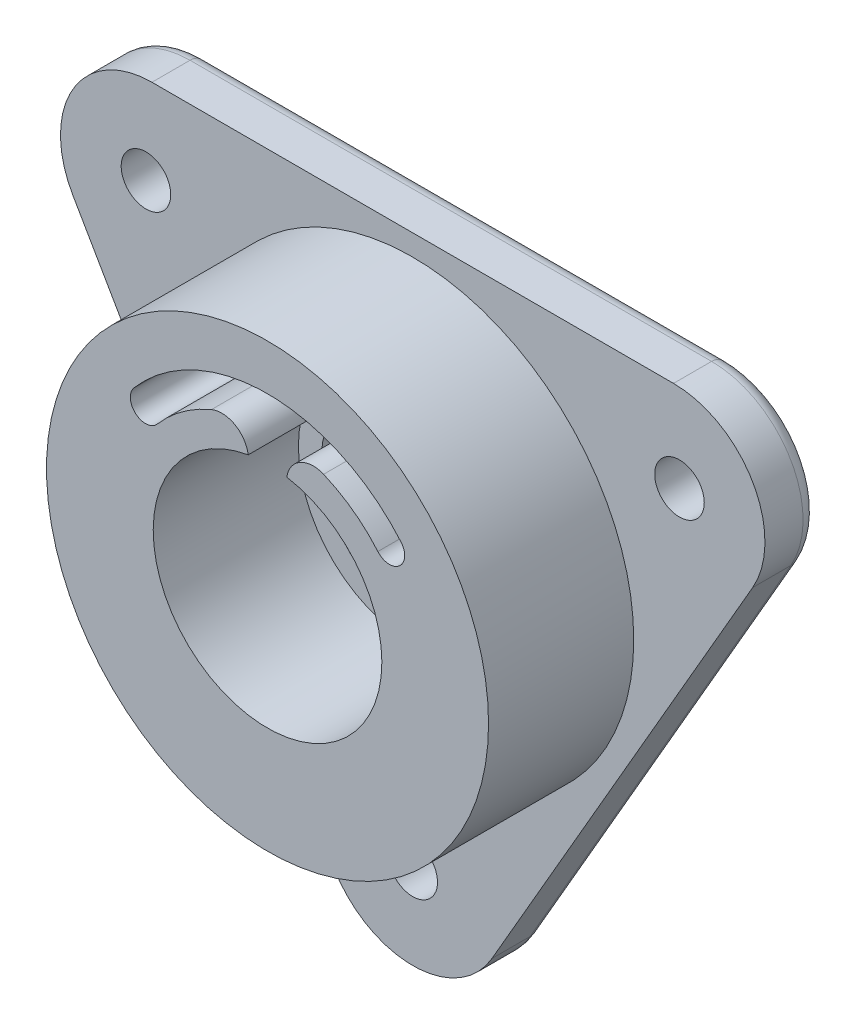
ISO-10303-21;
HEADER;
FILE_DESCRIPTION(('STEP AP214'),'2;1');
FILE_NAME('part.step','',(''),(''),'','','');
FILE_SCHEMA(('AUTOMOTIVE_DESIGN { 1 0 10303 214 1 1 1 1 }'));
ENDSEC;
DATA;
#1=APPLICATION_CONTEXT('core data for automotive mechanical design processes');
#2=APPLICATION_PROTOCOL_DEFINITION('international standard','automotive_design',2000,#1);
#3=PRODUCT_CONTEXT('',#1,'mechanical');
#4=PRODUCT('Part','Part','',(#3));
#5=PRODUCT_RELATED_PRODUCT_CATEGORY('part','',(#4));
#6=PRODUCT_DEFINITION_FORMATION('','',#4);
#7=PRODUCT_DEFINITION_CONTEXT('part definition',#1,'design');
#8=PRODUCT_DEFINITION('design','',#6,#7);
#9=PRODUCT_DEFINITION_SHAPE('','',#8);
#10=(LENGTH_UNIT() NAMED_UNIT(*) SI_UNIT(.MILLI.,.METRE.));
#11=(NAMED_UNIT(*) PLANE_ANGLE_UNIT() SI_UNIT($,.RADIAN.));
#12=(NAMED_UNIT(*) SI_UNIT($,.STERADIAN.) SOLID_ANGLE_UNIT());
#13=UNCERTAINTY_MEASURE_WITH_UNIT(LENGTH_MEASURE(1.E-05),#10,'distance_accuracy_value','');
#14=(GEOMETRIC_REPRESENTATION_CONTEXT(3) GLOBAL_UNCERTAINTY_ASSIGNED_CONTEXT((#13)) GLOBAL_UNIT_ASSIGNED_CONTEXT((#10,
#11,#12)) REPRESENTATION_CONTEXT('',''));
#15=CARTESIAN_POINT('',(0.,0.,0.));
#16=DIRECTION('',(0.,0.,1.));
#17=DIRECTION('',(1.,0.,0.));
#18=AXIS2_PLACEMENT_3D('',#15,#16,#17);
#19=CARTESIAN_POINT('',(0.,0.,0.));
#20=DIRECTION('',(0.,0.,-1.));
#21=DIRECTION('',(-1.,0.,0.));
#22=AXIS2_PLACEMENT_3D('',#19,#20,#21);
#23=PLANE('',#22);
#24=CARTESIAN_POINT('',(0.,-20.2072594216369,0.));
#25=DIRECTION('',(0.,0.,1.));
#26=DIRECTION('',(1.,0.,0.));
#27=AXIS2_PLACEMENT_3D('',#24,#25,#26);
#28=CIRCLE('',#27,1.625);
#29=CARTESIAN_POINT('',(1.62500000000001,-20.2072594216369,0.));
#30=VERTEX_POINT('',#29);
#31=EDGE_CURVE('E204',#30,#30,#28,.T.);
#32=ORIENTED_EDGE('',*,*,#31,.T.);
#33=EDGE_LOOP('',(#32));
#34=FACE_BOUND('',#33,.T.);
#35=CARTESIAN_POINT('',(17.5,10.1036297108185,0.));
#36=DIRECTION('',(0.,0.,1.));
#37=DIRECTION('',(1.,0.,0.));
#38=AXIS2_PLACEMENT_3D('',#35,#36,#37);
#39=CIRCLE('',#38,1.625);
#40=CARTESIAN_POINT('',(19.125,10.1036297108185,0.));
#41=VERTEX_POINT('',#40);
#42=EDGE_CURVE('E210',#41,#41,#39,.T.);
#43=ORIENTED_EDGE('',*,*,#42,.T.);
#44=EDGE_LOOP('',(#43));
#45=FACE_BOUND('',#44,.T.);
#46=CARTESIAN_POINT('',(-17.5,10.1036297108185,0.));
#47=DIRECTION('',(0.,0.,1.));
#48=DIRECTION('',(1.,0.,0.));
#49=AXIS2_PLACEMENT_3D('',#46,#47,#48);
#50=CIRCLE('',#49,1.625);
#51=CARTESIAN_POINT('',(-15.875,10.1036297108185,0.));
#52=VERTEX_POINT('',#51);
#53=EDGE_CURVE('E194',#52,#52,#50,.T.);
#54=ORIENTED_EDGE('',*,*,#53,.T.);
#55=EDGE_LOOP('',(#54));
#56=FACE_BOUND('',#55,.T.);
#57=CARTESIAN_POINT('',(0.,-19.7542648054294,0.));
#58=DIRECTION('',(0.,0.,-1.));
#59=DIRECTION('',(-1.,0.,0.));
#60=AXIS2_PLACEMENT_3D('',#57,#58,#59);
#61=CIRCLE('',#60,5.);
#62=CARTESIAN_POINT('',(-4.33012701892219,-22.2542648054294,0.));
#63=VERTEX_POINT('',#62);
#64=CARTESIAN_POINT('',(4.33012701892219,-22.2542648054294,0.));
#65=VERTEX_POINT('',#64);
#66=EDGE_CURVE('E256',#63,#65,#61,.F.);
#67=ORIENTED_EDGE('',*,*,#66,.F.);
#68=DIRECTION('',(0.5,-0.866025403784439,0.));
#69=VECTOR('',#68,1.);
#70=CARTESIAN_POINT('',(-26.6339745962156,16.3771324027147,0.));
#71=LINE('',#70,#69);
#72=CARTESIAN_POINT('',(-21.4378221735089,7.37713240271472,0.));
#73=VERTEX_POINT('',#72);
#74=EDGE_CURVE('E231',#63,#73,#71,.F.);
#75=ORIENTED_EDGE('',*,*,#74,.T.);
#76=CARTESIAN_POINT('',(-17.1076951545867,9.87713240271472,0.));
#77=DIRECTION('',(0.,0.,-1.));
#78=DIRECTION('',(-1.,0.,0.));
#79=AXIS2_PLACEMENT_3D('',#76,#77,#78);
#80=CIRCLE('',#79,5.);
#81=CARTESIAN_POINT('',(-17.1076951545867,14.8771324027147,0.));
#82=VERTEX_POINT('',#81);
#83=EDGE_CURVE('E254',#82,#73,#80,.F.);
#84=ORIENTED_EDGE('',*,*,#83,.F.);
#85=DIRECTION('',(-1.,0.,0.));
#86=VECTOR('',#85,1.);
#87=CARTESIAN_POINT('',(27.5,14.8771324027147,0.));
#88=LINE('',#87,#86);
#89=CARTESIAN_POINT('',(17.1076951545867,14.8771324027147,0.));
#90=VERTEX_POINT('',#89);
#91=EDGE_CURVE('E237',#82,#90,#88,.F.);
#92=ORIENTED_EDGE('',*,*,#91,.T.);
#93=CARTESIAN_POINT('',(17.1076951545867,9.87713240271472,0.));
#94=DIRECTION('',(0.,0.,-1.));
#95=DIRECTION('',(-1.,0.,0.));
#96=AXIS2_PLACEMENT_3D('',#93,#94,#95);
#97=CIRCLE('',#96,5.);
#98=CARTESIAN_POINT('',(21.4378221735089,7.37713240271472,0.));
#99=VERTEX_POINT('',#98);
#100=EDGE_CURVE('E251',#99,#90,#97,.F.);
#101=ORIENTED_EDGE('',*,*,#100,.F.);
#102=DIRECTION('',(0.5,0.866025403784439,0.));
#103=VECTOR('',#102,1.);
#104=CARTESIAN_POINT('',(-0.86602540378445,-31.2542648054294,0.));
#105=LINE('',#104,#103);
#106=EDGE_CURVE('E234',#99,#65,#105,.F.);
#107=ORIENTED_EDGE('',*,*,#106,.T.);
#108=EDGE_LOOP('',(#67,#75,#84,#92,#101,#107));
#109=FACE_BOUND('',#108,.T.);
#110=CARTESIAN_POINT('',(3.,7.14580296397823,0.));
#111=DIRECTION('',(0.,0.,-1.));
#112=DIRECTION('',(1.,0.,0.));
#113=AXIS2_PLACEMENT_3D('',#110,#111,#112);
#114=CIRCLE('',#113,1.75);
#115=CARTESIAN_POINT('',(2.32258064516129,5.53223455275734,0.));
#116=VERTEX_POINT('',#115);
#117=CARTESIAN_POINT('',(3.67741935483871,8.75937137519911,0.));
#118=VERTEX_POINT('',#117);
#119=EDGE_CURVE('E187',#116,#118,#114,.T.);
#120=ORIENTED_EDGE('',*,*,#119,.T.);
#121=CARTESIAN_POINT('',(0.,0.,0.));
#122=DIRECTION('',(0.,0.,-1.));
#123=DIRECTION('',(-1.,0.,0.));
#124=AXIS2_PLACEMENT_3D('',#121,#122,#123);
#125=CIRCLE('',#124,9.5);
#126=CARTESIAN_POINT('',(7.23809523809524,6.15304618252318,0.));
#127=VERTEX_POINT('',#126);
#128=EDGE_CURVE('E615',#118,#127,#125,.T.);
#129=ORIENTED_EDGE('',*,*,#128,.T.);
#130=CARTESIAN_POINT('',(8.,6.80073525436772,0.));
#131=DIRECTION('',(0.,0.,1.));
#132=DIRECTION('',(1.,0.,0.));
#133=AXIS2_PLACEMENT_3D('',#130,#131,#132);
#134=CIRCLE('',#133,1.);
#135=CARTESIAN_POINT('',(8.76190476190476,7.44842432621227,0.));
#136=VERTEX_POINT('',#135);
#137=EDGE_CURVE('E622',#127,#136,#134,.T.);
#138=ORIENTED_EDGE('',*,*,#137,.T.);
#139=CARTESIAN_POINT('',(0.,0.,0.));
#140=DIRECTION('',(0.,0.,1.));
#141=DIRECTION('',(1.,0.,0.));
#142=AXIS2_PLACEMENT_3D('',#139,#140,#141);
#143=CIRCLE('',#142,11.5);
#144=CARTESIAN_POINT('',(-8.76190476190476,7.44842432621227,0.));
#145=VERTEX_POINT('',#144);
#146=EDGE_CURVE('E312',#136,#145,#143,.T.);
#147=ORIENTED_EDGE('',*,*,#146,.T.);
#148=CARTESIAN_POINT('',(-8.,6.80073525436772,0.));
#149=DIRECTION('',(0.,0.,1.));
#150=DIRECTION('',(1.,0.,0.));
#151=AXIS2_PLACEMENT_3D('',#148,#149,#150);
#152=CIRCLE('',#151,1.);
#153=CARTESIAN_POINT('',(-7.23809523809524,6.15304618252318,0.));
#154=VERTEX_POINT('',#153);
#155=EDGE_CURVE('E620',#145,#154,#152,.T.);
#156=ORIENTED_EDGE('',*,*,#155,.T.);
#157=CARTESIAN_POINT('',(-3.67741935483871,8.75937137519911,0.));
#158=VERTEX_POINT('',#157);
#159=EDGE_CURVE('E186',#154,#158,#125,.T.);
#160=ORIENTED_EDGE('',*,*,#159,.T.);
#161=CARTESIAN_POINT('',(-3.,7.14580296397823,0.));
#162=DIRECTION('',(0.,0.,-1.));
#163=DIRECTION('',(1.,0.,0.));
#164=AXIS2_PLACEMENT_3D('',#161,#162,#163);
#165=CIRCLE('',#164,1.75);
#166=CARTESIAN_POINT('',(-2.32258064516129,5.53223455275734,0.));
#167=VERTEX_POINT('',#166);
#168=EDGE_CURVE('E55',#158,#167,#165,.T.);
#169=ORIENTED_EDGE('',*,*,#168,.T.);
#170=CARTESIAN_POINT('',(0.,0.,0.));
#171=DIRECTION('',(0.,0.,1.));
#172=DIRECTION('',(1.,0.,0.));
#173=AXIS2_PLACEMENT_3D('',#170,#171,#172);
#174=CIRCLE('',#173,6.);
#175=EDGE_CURVE('E183',#167,#116,#174,.T.);
#176=ORIENTED_EDGE('',*,*,#175,.T.);
#177=EDGE_LOOP('',(#120,#129,#138,#147,#156,#160,#169,#176));
#178=FACE_BOUND('',#177,.T.);
#179=ADVANCED_FACE('F38',(#34,#45,#56,#109,#178),#23,.T.);
#180=CARTESIAN_POINT('',(0.,0.,13.025));
#181=DIRECTION('',(0.,0.,1.));
#182=DIRECTION('',(1.,0.,0.));
#183=AXIS2_PLACEMENT_3D('',#180,#181,#182);
#184=PLANE('',#183);
#185=CARTESIAN_POINT('',(0.,0.,13.025));
#186=DIRECTION('',(0.,0.,1.));
#187=DIRECTION('',(1.,0.,0.));
#188=AXIS2_PLACEMENT_3D('',#185,#186,#187);
#189=CIRCLE('',#188,14.5);
#190=CARTESIAN_POINT('',(14.5,0.,13.025));
#191=VERTEX_POINT('',#190);
#192=EDGE_CURVE('E192',#191,#191,#189,.T.);
#193=ORIENTED_EDGE('',*,*,#192,.T.);
#194=EDGE_LOOP('',(#193));
#195=FACE_BOUND('',#194,.T.);
#196=CARTESIAN_POINT('',(3.,7.14580296397823,13.025));
#197=DIRECTION('',(0.,0.,-1.));
#198=DIRECTION('',(1.,0.,0.));
#199=AXIS2_PLACEMENT_3D('',#196,#197,#198);
#200=CIRCLE('',#199,1.75);
#201=CARTESIAN_POINT('',(1.2674235171821,7.39213349636583,13.025));
#202=VERTEX_POINT('',#201);
#203=CARTESIAN_POINT('',(3.67741935483871,8.75937137519911,13.025));
#204=VERTEX_POINT('',#203);
#205=EDGE_CURVE('E63',#202,#204,#200,.T.);
#206=ORIENTED_EDGE('',*,*,#205,.F.);
#207=CARTESIAN_POINT('',(0.,0.,13.025));
#208=DIRECTION('',(0.,0.,1.));
#209=DIRECTION('',(1.,0.,0.));
#210=AXIS2_PLACEMENT_3D('',#207,#208,#209);
#211=CIRCLE('',#210,7.5);
#212=CARTESIAN_POINT('',(-1.2674235171821,7.39213349636583,13.025));
#213=VERTEX_POINT('',#212);
#214=EDGE_CURVE('E197',#213,#202,#211,.T.);
#215=ORIENTED_EDGE('',*,*,#214,.F.);
#216=CARTESIAN_POINT('',(-3.,7.14580296397823,13.025));
#217=DIRECTION('',(0.,0.,-1.));
#218=DIRECTION('',(1.,0.,0.));
#219=AXIS2_PLACEMENT_3D('',#216,#217,#218);
#220=CIRCLE('',#219,1.75);
#221=CARTESIAN_POINT('',(-3.67741935483871,8.75937137519911,13.025));
#222=VERTEX_POINT('',#221);
#223=EDGE_CURVE('E645',#222,#213,#220,.T.);
#224=ORIENTED_EDGE('',*,*,#223,.F.);
#225=CARTESIAN_POINT('',(0.,0.,13.025));
#226=DIRECTION('',(0.,0.,-1.));
#227=DIRECTION('',(-1.,0.,0.));
#228=AXIS2_PLACEMENT_3D('',#225,#226,#227);
#229=CIRCLE('',#228,9.5);
#230=CARTESIAN_POINT('',(-7.23809523809524,6.15304618252318,13.025));
#231=VERTEX_POINT('',#230);
#232=EDGE_CURVE('E633',#231,#222,#229,.T.);
#233=ORIENTED_EDGE('',*,*,#232,.F.);
#234=CARTESIAN_POINT('',(-8.,6.80073525436772,13.025));
#235=DIRECTION('',(0.,0.,1.));
#236=DIRECTION('',(1.,0.,0.));
#237=AXIS2_PLACEMENT_3D('',#234,#235,#236);
#238=CIRCLE('',#237,1.);
#239=CARTESIAN_POINT('',(-8.76190476190476,7.44842432621227,13.025));
#240=VERTEX_POINT('',#239);
#241=EDGE_CURVE('E629',#240,#231,#238,.T.);
#242=ORIENTED_EDGE('',*,*,#241,.F.);
#243=CARTESIAN_POINT('',(0.,0.,13.025));
#244=DIRECTION('',(0.,0.,1.));
#245=DIRECTION('',(1.,0.,0.));
#246=AXIS2_PLACEMENT_3D('',#243,#244,#245);
#247=CIRCLE('',#246,11.5);
#248=CARTESIAN_POINT('',(8.76190476190476,7.44842432621227,13.025));
#249=VERTEX_POINT('',#248);
#250=EDGE_CURVE('E304',#249,#240,#247,.T.);
#251=ORIENTED_EDGE('',*,*,#250,.F.);
#252=CARTESIAN_POINT('',(8.,6.80073525436772,13.025));
#253=DIRECTION('',(0.,0.,1.));
#254=DIRECTION('',(1.,0.,0.));
#255=AXIS2_PLACEMENT_3D('',#252,#253,#254);
#256=CIRCLE('',#255,1.);
#257=CARTESIAN_POINT('',(7.23809523809524,6.15304618252318,13.025));
#258=VERTEX_POINT('',#257);
#259=EDGE_CURVE('E635',#258,#249,#256,.T.);
#260=ORIENTED_EDGE('',*,*,#259,.F.);
#261=EDGE_CURVE('E631',#204,#258,#229,.T.);
#262=ORIENTED_EDGE('',*,*,#261,.F.);
#263=EDGE_LOOP('',(#206,#215,#224,#233,#242,#251,#260,#262));
#264=FACE_BOUND('',#263,.T.);
#265=ADVANCED_FACE('F346',(#195,#264),#184,.T.);
#266=CARTESIAN_POINT('',(0.,0.,3.5));
#267=DIRECTION('',(0.,0.,-1.));
#268=DIRECTION('',(-1.,0.,0.));
#269=AXIS2_PLACEMENT_3D('',#266,#267,#268);
#270=PLANE('',#269);
#271=CARTESIAN_POINT('',(0.,0.,3.5));
#272=DIRECTION('',(0.,0.,1.));
#273=DIRECTION('',(1.,0.,0.));
#274=AXIS2_PLACEMENT_3D('',#271,#272,#273);
#275=CIRCLE('',#274,7.5);
#276=CARTESIAN_POINT('',(-1.2674235171821,7.39213349636583,3.5));
#277=VERTEX_POINT('',#276);
#278=CARTESIAN_POINT('',(1.2674235171821,7.39213349636583,3.5));
#279=VERTEX_POINT('',#278);
#280=EDGE_CURVE('E284',#277,#279,#275,.T.);
#281=ORIENTED_EDGE('',*,*,#280,.T.);
#282=CARTESIAN_POINT('',(3.,7.14580296397823,3.5));
#283=DIRECTION('',(0.,0.,-1.));
#284=DIRECTION('',(-1.,0.,0.));
#285=AXIS2_PLACEMENT_3D('',#282,#283,#284);
#286=CIRCLE('',#285,1.75);
#287=CARTESIAN_POINT('',(2.32258064516129,5.53223455275734,3.5));
#288=VERTEX_POINT('',#287);
#289=EDGE_CURVE('E632',#279,#288,#286,.F.);
#290=ORIENTED_EDGE('',*,*,#289,.T.);
#291=CARTESIAN_POINT('',(0.,0.,3.5));
#292=DIRECTION('',(0.,0.,1.));
#293=DIRECTION('',(1.,0.,0.));
#294=AXIS2_PLACEMENT_3D('',#291,#292,#293);
#295=CIRCLE('',#294,6.);
#296=CARTESIAN_POINT('',(-2.32258064516129,5.53223455275734,3.5));
#297=VERTEX_POINT('',#296);
#298=EDGE_CURVE('E191',#297,#288,#295,.T.);
#299=ORIENTED_EDGE('',*,*,#298,.F.);
#300=CARTESIAN_POINT('',(-3.,7.14580296397823,3.5));
#301=DIRECTION('',(0.,0.,-1.));
#302=DIRECTION('',(-1.,0.,0.));
#303=AXIS2_PLACEMENT_3D('',#300,#301,#302);
#304=CIRCLE('',#303,1.75);
#305=EDGE_CURVE('E171',#297,#277,#304,.F.);
#306=ORIENTED_EDGE('',*,*,#305,.T.);
#307=EDGE_LOOP('',(#281,#290,#299,#306));
#308=FACE_BOUND('',#307,.T.);
#309=ADVANCED_FACE('F327',(#308),#270,.F.);
#310=CARTESIAN_POINT('',(0.,0.,0.));
#311=DIRECTION('',(0.,0.,1.));
#312=DIRECTION('',(1.,0.,0.));
#313=AXIS2_PLACEMENT_3D('',#310,#311,#312);
#314=CYLINDRICAL_SURFACE('',#313,9.5);
#315=DIRECTION('',(0.,0.,1.));
#316=VECTOR('',#315,1.);
#317=CARTESIAN_POINT('',(-3.67741935483871,8.75937137519911,0.));
#318=LINE('',#317,#316);
#319=EDGE_CURVE('E177',#158,#222,#318,.T.);
#320=ORIENTED_EDGE('',*,*,#319,.F.);
#321=ORIENTED_EDGE('',*,*,#159,.F.);
#322=DIRECTION('',(0.,0.,1.));
#323=VECTOR('',#322,1.);
#324=CARTESIAN_POINT('',(-7.23809523809524,6.15304618252318,0.));
#325=LINE('',#324,#323);
#326=EDGE_CURVE('E309',#154,#231,#325,.T.);
#327=ORIENTED_EDGE('',*,*,#326,.T.);
#328=ORIENTED_EDGE('',*,*,#232,.T.);
#329=EDGE_LOOP('',(#320,#321,#327,#328));
#330=FACE_BOUND('',#329,.T.);
#331=ADVANCED_FACE('F325',(#330),#314,.T.);
#332=CARTESIAN_POINT('',(0.,0.,3.5));
#333=DIRECTION('',(0.,0.,1.));
#334=DIRECTION('',(1.,0.,0.));
#335=AXIS2_PLACEMENT_3D('',#332,#333,#334);
#336=CIRCLE('',#335,14.5);
#337=CARTESIAN_POINT('',(14.5,0.,3.5));
#338=VERTEX_POINT('',#337);
#339=EDGE_CURVE('E227',#338,#338,#336,.T.);
#340=ORIENTED_EDGE('',*,*,#339,.F.);
#341=EDGE_LOOP('',(#340));
#342=FACE_BOUND('',#341,.T.);
#343=DIRECTION('',(0.5,0.866025403784439,0.));
#344=VECTOR('',#343,1.);
#345=CARTESIAN_POINT('',(27.5,15.8771324027147,3.5));
#346=LINE('',#345,#344);
#347=CARTESIAN_POINT('',(5.19615242270662,-22.7542648054294,3.5));
#348=VERTEX_POINT('',#347);
#349=CARTESIAN_POINT('',(22.3038475772934,6.87713240271471,3.5));
#350=VERTEX_POINT('',#349);
#351=EDGE_CURVE('E216',#348,#350,#346,.T.);
#352=ORIENTED_EDGE('',*,*,#351,.T.);
#353=CARTESIAN_POINT('',(17.1076951545867,9.87713240271472,3.5));
#354=DIRECTION('',(0.,0.,-1.));
#355=DIRECTION('',(-1.,0.,0.));
#356=AXIS2_PLACEMENT_3D('',#353,#354,#355);
#357=CIRCLE('',#356,6.);
#358=CARTESIAN_POINT('',(17.1076951545867,15.8771324027147,3.5));
#359=VERTEX_POINT('',#358);
#360=EDGE_CURVE('E279',#350,#359,#357,.F.);
#361=ORIENTED_EDGE('',*,*,#360,.T.);
#362=DIRECTION('',(-1.,0.,0.));
#363=VECTOR('',#362,1.);
#364=CARTESIAN_POINT('',(-27.5,15.8771324027147,3.5));
#365=LINE('',#364,#363);
#366=CARTESIAN_POINT('',(-17.1076951545867,15.8771324027147,3.5));
#367=VERTEX_POINT('',#366);
#368=EDGE_CURVE('E221',#359,#367,#365,.T.);
#369=ORIENTED_EDGE('',*,*,#368,.T.);
#370=CARTESIAN_POINT('',(-17.1076951545867,9.87713240271472,3.5));
#371=DIRECTION('',(0.,0.,-1.));
#372=DIRECTION('',(-1.,0.,0.));
#373=AXIS2_PLACEMENT_3D('',#370,#371,#372);
#374=CIRCLE('',#373,6.);
#375=CARTESIAN_POINT('',(-22.3038475772934,6.87713240271472,3.5));
#376=VERTEX_POINT('',#375);
#377=EDGE_CURVE('E277',#367,#376,#374,.F.);
#378=ORIENTED_EDGE('',*,*,#377,.T.);
#379=DIRECTION('',(0.5,-0.866025403784439,0.));
#380=VECTOR('',#379,1.);
#381=CARTESIAN_POINT('',(0.,-31.7542648054294,3.5));
#382=LINE('',#381,#380);
#383=CARTESIAN_POINT('',(-5.19615242270663,-22.7542648054294,3.5));
#384=VERTEX_POINT('',#383);
#385=EDGE_CURVE('E224',#376,#384,#382,.T.);
#386=ORIENTED_EDGE('',*,*,#385,.T.);
#387=CARTESIAN_POINT('',(0.,-19.7542648054294,3.5));
#388=DIRECTION('',(0.,0.,-1.));
#389=DIRECTION('',(-1.,0.,0.));
#390=AXIS2_PLACEMENT_3D('',#387,#388,#389);
#391=CIRCLE('',#390,6.);
#392=EDGE_CURVE('E275',#384,#348,#391,.F.);
#393=ORIENTED_EDGE('',*,*,#392,.T.);
#394=EDGE_LOOP('',(#352,#361,#369,#378,#386,#393));
#395=FACE_BOUND('',#394,.T.);
#396=CARTESIAN_POINT('',(17.5,10.1036297108185,3.5));
#397=DIRECTION('',(0.,0.,1.));
#398=DIRECTION('',(1.,0.,0.));
#399=AXIS2_PLACEMENT_3D('',#396,#397,#398);
#400=CIRCLE('',#399,1.625);
#401=CARTESIAN_POINT('',(19.125,10.1036297108185,3.5));
#402=VERTEX_POINT('',#401);
#403=EDGE_CURVE('E213',#402,#402,#400,.T.);
#404=ORIENTED_EDGE('',*,*,#403,.F.);
#405=EDGE_LOOP('',(#404));
#406=FACE_BOUND('',#405,.T.);
#407=CARTESIAN_POINT('',(0.,-20.2072594216369,3.5));
#408=DIRECTION('',(0.,0.,1.));
#409=DIRECTION('',(1.,0.,0.));
#410=AXIS2_PLACEMENT_3D('',#407,#408,#409);
#411=CIRCLE('',#410,1.625);
#412=CARTESIAN_POINT('',(1.62500000000001,-20.2072594216369,3.5));
#413=VERTEX_POINT('',#412);
#414=EDGE_CURVE('E207',#413,#413,#411,.T.);
#415=ORIENTED_EDGE('',*,*,#414,.F.);
#416=EDGE_LOOP('',(#415));
#417=FACE_BOUND('',#416,.T.);
#418=CARTESIAN_POINT('',(-17.5,10.1036297108185,3.5));
#419=DIRECTION('',(0.,0.,1.));
#420=DIRECTION('',(1.,0.,0.));
#421=AXIS2_PLACEMENT_3D('',#418,#419,#420);
#422=CIRCLE('',#421,1.625);
#423=CARTESIAN_POINT('',(-15.875,10.1036297108185,3.5));
#424=VERTEX_POINT('',#423);
#425=EDGE_CURVE('E201',#424,#424,#422,.T.);
#426=ORIENTED_EDGE('',*,*,#425,.F.);
#427=EDGE_LOOP('',(#426));
#428=FACE_BOUND('',#427,.T.);
#429=ADVANCED_FACE('F321',(#342,#395,#406,#417,#428),#270,.F.);
#430=CARTESIAN_POINT('',(27.5,15.8771324027147,3.5));
#431=DIRECTION('',(-0.866025403784439,0.5,0.));
#432=DIRECTION('',(-0.5,-0.866025403784439,0.));
#433=AXIS2_PLACEMENT_3D('',#430,#431,#432);
#434=PLANE('',#433);
#435=DIRECTION('',(0.5,0.866025403784439,0.));
#436=VECTOR('',#435,1.);
#437=CARTESIAN_POINT('',(27.5,15.8771324027147,1.));
#438=LINE('',#437,#436);
#439=CARTESIAN_POINT('',(5.19615242270662,-22.7542648054294,1.));
#440=VERTEX_POINT('',#439);
#441=CARTESIAN_POINT('',(22.3038475772934,6.87713240271471,1.));
#442=VERTEX_POINT('',#441);
#443=EDGE_CURVE('E240',#440,#442,#438,.T.);
#444=ORIENTED_EDGE('',*,*,#443,.T.);
#445=DIRECTION('',(0.,0.,-1.));
#446=VECTOR('',#445,1.);
#447=CARTESIAN_POINT('',(22.3038475772934,6.87713240271471,3.5));
#448=LINE('',#447,#446);
#449=EDGE_CURVE('E273',#442,#350,#448,.F.);
#450=ORIENTED_EDGE('',*,*,#449,.T.);
#451=ORIENTED_EDGE('',*,*,#351,.F.);
#452=DIRECTION('',(0.,0.,-1.));
#453=VECTOR('',#452,1.);
#454=CARTESIAN_POINT('',(5.19615242270662,-22.7542648054294,3.5));
#455=LINE('',#454,#453);
#456=EDGE_CURVE('E271',#348,#440,#455,.T.);
#457=ORIENTED_EDGE('',*,*,#456,.T.);
#458=EDGE_LOOP('',(#444,#450,#451,#457));
#459=FACE_BOUND('',#458,.T.);
#460=ADVANCED_FACE('F324',(#459),#434,.F.);
#461=CARTESIAN_POINT('',(-27.5,15.8771324027147,3.5));
#462=DIRECTION('',(0.,-1.,0.));
#463=DIRECTION('',(0.,0.,-1.));
#464=AXIS2_PLACEMENT_3D('',#461,#462,#463);
#465=PLANE('',#464);
#466=ORIENTED_EDGE('',*,*,#368,.F.);
#467=DIRECTION('',(0.,0.,-1.));
#468=VECTOR('',#467,1.);
#469=CARTESIAN_POINT('',(17.1076951545867,15.8771324027147,3.5));
#470=LINE('',#469,#468);
#471=CARTESIAN_POINT('',(17.1076951545867,15.8771324027147,1.));
#472=VERTEX_POINT('',#471);
#473=EDGE_CURVE('E269',#359,#472,#470,.T.);
#474=ORIENTED_EDGE('',*,*,#473,.T.);
#475=DIRECTION('',(-1.,0.,0.));
#476=VECTOR('',#475,1.);
#477=CARTESIAN_POINT('',(-27.5,15.8771324027147,1.));
#478=LINE('',#477,#476);
#479=CARTESIAN_POINT('',(-17.1076951545867,15.8771324027147,1.));
#480=VERTEX_POINT('',#479);
#481=EDGE_CURVE('E228',#472,#480,#478,.T.);
#482=ORIENTED_EDGE('',*,*,#481,.T.);
#483=DIRECTION('',(0.,0.,-1.));
#484=VECTOR('',#483,1.);
#485=CARTESIAN_POINT('',(-17.1076951545867,15.8771324027147,3.5));
#486=LINE('',#485,#484);
#487=EDGE_CURVE('E267',#480,#367,#486,.F.);
#488=ORIENTED_EDGE('',*,*,#487,.T.);
#489=EDGE_LOOP('',(#466,#474,#482,#488));
#490=FACE_BOUND('',#489,.T.);
#491=ADVANCED_FACE('F388',(#490),#465,.F.);
#492=CARTESIAN_POINT('',(0.,-31.7542648054294,3.5));
#493=DIRECTION('',(0.866025403784439,0.5,0.));
#494=DIRECTION('',(-0.5,0.866025403784439,0.));
#495=AXIS2_PLACEMENT_3D('',#492,#493,#494);
#496=PLANE('',#495);
#497=ORIENTED_EDGE('',*,*,#385,.F.);
#498=DIRECTION('',(0.,0.,-1.));
#499=VECTOR('',#498,1.);
#500=CARTESIAN_POINT('',(-22.3038475772934,6.87713240271472,3.5));
#501=LINE('',#500,#499);
#502=CARTESIAN_POINT('',(-22.3038475772934,6.87713240271471,1.));
#503=VERTEX_POINT('',#502);
#504=EDGE_CURVE('E11',#376,#503,#501,.T.);
#505=ORIENTED_EDGE('',*,*,#504,.T.);
#506=DIRECTION('',(0.5,-0.866025403784439,0.));
#507=VECTOR('',#506,1.);
#508=CARTESIAN_POINT('',(0.,-31.7542648054294,1.));
#509=LINE('',#508,#507);
#510=CARTESIAN_POINT('',(-5.19615242270663,-22.7542648054294,1.));
#511=VERTEX_POINT('',#510);
#512=EDGE_CURVE('E243',#503,#511,#509,.T.);
#513=ORIENTED_EDGE('',*,*,#512,.T.);
#514=DIRECTION('',(0.,0.,-1.));
#515=VECTOR('',#514,1.);
#516=CARTESIAN_POINT('',(-5.19615242270663,-22.7542648054294,3.5));
#517=LINE('',#516,#515);
#518=EDGE_CURVE('E47',#511,#384,#517,.F.);
#519=ORIENTED_EDGE('',*,*,#518,.T.);
#520=EDGE_LOOP('',(#497,#505,#513,#519));
#521=FACE_BOUND('',#520,.T.);
#522=ADVANCED_FACE('F367',(#521),#496,.F.);
#523=CARTESIAN_POINT('',(17.5,10.1036297108185,3.5));
#524=DIRECTION('',(0.,0.,-1.));
#525=DIRECTION('',(-1.,0.,0.));
#526=AXIS2_PLACEMENT_3D('',#523,#524,#525);
#527=CYLINDRICAL_SURFACE('',#526,1.625);
#528=ORIENTED_EDGE('',*,*,#403,.T.);
#529=EDGE_LOOP('',(#528));
#530=FACE_BOUND('',#529,.T.);
#531=ORIENTED_EDGE('',*,*,#42,.F.);
#532=EDGE_LOOP('',(#531));
#533=FACE_BOUND('',#532,.T.);
#534=ADVANCED_FACE('F395',(#530,#533),#527,.F.);
#535=CARTESIAN_POINT('',(0.,-20.2072594216369,3.5));
#536=DIRECTION('',(0.,0.,-1.));
#537=DIRECTION('',(-1.,0.,0.));
#538=AXIS2_PLACEMENT_3D('',#535,#536,#537);
#539=CYLINDRICAL_SURFACE('',#538,1.625);
#540=ORIENTED_EDGE('',*,*,#414,.T.);
#541=EDGE_LOOP('',(#540));
#542=FACE_BOUND('',#541,.T.);
#543=ORIENTED_EDGE('',*,*,#31,.F.);
#544=EDGE_LOOP('',(#543));
#545=FACE_BOUND('',#544,.T.);
#546=ADVANCED_FACE('F340',(#542,#545),#539,.F.);
#547=CARTESIAN_POINT('',(-17.5,10.1036297108185,3.5));
#548=DIRECTION('',(0.,0.,-1.));
#549=DIRECTION('',(-1.,0.,0.));
#550=AXIS2_PLACEMENT_3D('',#547,#548,#549);
#551=CYLINDRICAL_SURFACE('',#550,1.625);
#552=ORIENTED_EDGE('',*,*,#425,.T.);
#553=EDGE_LOOP('',(#552));
#554=FACE_BOUND('',#553,.T.);
#555=ORIENTED_EDGE('',*,*,#53,.F.);
#556=EDGE_LOOP('',(#555));
#557=FACE_BOUND('',#556,.T.);
#558=ADVANCED_FACE('F337',(#554,#557),#551,.F.);
#559=CARTESIAN_POINT('',(0.,0.,3.5));
#560=DIRECTION('',(0.,0.,-1.));
#561=DIRECTION('',(-1.,0.,0.));
#562=AXIS2_PLACEMENT_3D('',#559,#560,#561);
#563=CYLINDRICAL_SURFACE('',#562,6.);
#564=DIRECTION('',(0.,0.,1.));
#565=VECTOR('',#564,1.);
#566=CARTESIAN_POINT('',(2.32258064516129,5.53223455275734,0.));
#567=LINE('',#566,#565);
#568=EDGE_CURVE('E176',#116,#288,#567,.T.);
#569=ORIENTED_EDGE('',*,*,#568,.F.);
#570=ORIENTED_EDGE('',*,*,#175,.F.);
#571=DIRECTION('',(0.,0.,1.));
#572=VECTOR('',#571,1.);
#573=CARTESIAN_POINT('',(-2.32258064516129,5.53223455275734,0.));
#574=LINE('',#573,#572);
#575=EDGE_CURVE('E168',#167,#297,#574,.T.);
#576=ORIENTED_EDGE('',*,*,#575,.T.);
#577=ORIENTED_EDGE('',*,*,#298,.T.);
#578=EDGE_LOOP('',(#569,#570,#576,#577));
#579=FACE_BOUND('',#578,.T.);
#580=ADVANCED_FACE('F190',(#579),#563,.F.);
#581=CARTESIAN_POINT('',(0.,0.,13.025));
#582=DIRECTION('',(0.,0.,-1.));
#583=DIRECTION('',(-1.,0.,0.));
#584=AXIS2_PLACEMENT_3D('',#581,#582,#583);
#585=CYLINDRICAL_SURFACE('',#584,14.5);
#586=ORIENTED_EDGE('',*,*,#192,.F.);
#587=EDGE_LOOP('',(#586));
#588=FACE_BOUND('',#587,.T.);
#589=ORIENTED_EDGE('',*,*,#339,.T.);
#590=EDGE_LOOP('',(#589));
#591=FACE_BOUND('',#590,.T.);
#592=ADVANCED_FACE('F319',(#588,#591),#585,.T.);
#593=CARTESIAN_POINT('',(0.,0.,13.025));
#594=DIRECTION('',(0.,0.,-1.));
#595=DIRECTION('',(-1.,0.,0.));
#596=AXIS2_PLACEMENT_3D('',#593,#594,#595);
#597=CYLINDRICAL_SURFACE('',#596,7.5);
#598=DIRECTION('',(0.,0.,1.));
#599=VECTOR('',#598,1.);
#600=CARTESIAN_POINT('',(1.2674235171821,7.39213349636583,6.5125));
#601=LINE('',#600,#599);
#602=EDGE_CURVE('E650',#279,#202,#601,.T.);
#603=ORIENTED_EDGE('',*,*,#602,.F.);
#604=ORIENTED_EDGE('',*,*,#280,.F.);
#605=DIRECTION('',(0.,0.,1.));
#606=VECTOR('',#605,1.);
#607=CARTESIAN_POINT('',(-1.2674235171821,7.39213349636583,6.5125));
#608=LINE('',#607,#606);
#609=EDGE_CURVE('E651',#213,#277,#608,.F.);
#610=ORIENTED_EDGE('',*,*,#609,.F.);
#611=ORIENTED_EDGE('',*,*,#214,.T.);
#612=EDGE_LOOP('',(#603,#604,#610,#611));
#613=FACE_BOUND('',#612,.T.);
#614=ADVANCED_FACE('F405',(#613),#597,.F.);
#615=CARTESIAN_POINT('',(26.6339745962156,16.3771324027147,1.));
#616=DIRECTION('',(-0.5,-0.866025403784439,0.));
#617=DIRECTION('',(0.866025403784439,-0.5,0.));
#618=AXIS2_PLACEMENT_3D('',#615,#616,#617);
#619=CYLINDRICAL_SURFACE('',#618,1.);
#620=ORIENTED_EDGE('',*,*,#443,.F.);
#621=CARTESIAN_POINT('',(4.33012701892219,-22.2542648054294,1.));
#622=DIRECTION('',(0.5,0.866025403784438,0.));
#623=DIRECTION('',(-0.866025403784438,0.5,0.));
#624=AXIS2_PLACEMENT_3D('',#621,#622,#623);
#625=CIRCLE('',#624,1.);
#626=EDGE_CURVE('E248',#440,#65,#625,.T.);
#627=ORIENTED_EDGE('',*,*,#626,.T.);
#628=ORIENTED_EDGE('',*,*,#106,.F.);
#629=CARTESIAN_POINT('',(21.4378221735089,7.37713240271471,1.));
#630=DIRECTION('',(-0.5,-0.866025403784439,0.));
#631=DIRECTION('',(0.866025403784439,-0.5,0.));
#632=AXIS2_PLACEMENT_3D('',#629,#630,#631);
#633=CIRCLE('',#632,1.);
#634=EDGE_CURVE('E246',#99,#442,#633,.T.);
#635=ORIENTED_EDGE('',*,*,#634,.T.);
#636=EDGE_LOOP('',(#620,#627,#628,#635));
#637=FACE_BOUND('',#636,.T.);
#638=ADVANCED_FACE('F382',(#637),#619,.T.);
#639=CARTESIAN_POINT('',(0.866025403784439,-31.2542648054294,1.));
#640=DIRECTION('',(-0.5,0.866025403784439,0.));
#641=DIRECTION('',(-0.866025403784439,-0.5,0.));
#642=AXIS2_PLACEMENT_3D('',#639,#640,#641);
#643=CYLINDRICAL_SURFACE('',#642,1.);
#644=ORIENTED_EDGE('',*,*,#512,.F.);
#645=CARTESIAN_POINT('',(-21.4378221735089,7.37713240271472,1.));
#646=DIRECTION('',(0.499999999999999,-0.866025403784439,0.));
#647=DIRECTION('',(0.866025403784439,0.499999999999999,0.));
#648=AXIS2_PLACEMENT_3D('',#645,#646,#647);
#649=CIRCLE('',#648,1.);
#650=EDGE_CURVE('E260',#503,#73,#649,.T.);
#651=ORIENTED_EDGE('',*,*,#650,.T.);
#652=ORIENTED_EDGE('',*,*,#74,.F.);
#653=CARTESIAN_POINT('',(-4.3301270189222,-22.2542648054294,1.));
#654=DIRECTION('',(-0.5,0.866025403784438,0.));
#655=DIRECTION('',(-0.866025403784438,-0.5,0.));
#656=AXIS2_PLACEMENT_3D('',#653,#654,#655);
#657=CIRCLE('',#656,1.);
#658=EDGE_CURVE('E258',#63,#511,#657,.T.);
#659=ORIENTED_EDGE('',*,*,#658,.T.);
#660=EDGE_LOOP('',(#644,#651,#652,#659));
#661=FACE_BOUND('',#660,.T.);
#662=ADVANCED_FACE('F357',(#661),#643,.T.);
#663=CARTESIAN_POINT('',(-27.5,14.8771324027147,1.));
#664=DIRECTION('',(1.,0.,0.));
#665=DIRECTION('',(0.,0.,-1.));
#666=AXIS2_PLACEMENT_3D('',#663,#664,#665);
#667=CYLINDRICAL_SURFACE('',#666,1.);
#668=ORIENTED_EDGE('',*,*,#481,.F.);
#669=CARTESIAN_POINT('',(17.1076951545867,14.8771324027147,1.));
#670=DIRECTION('',(-1.,0.,0.));
#671=DIRECTION('',(0.,0.,1.));
#672=AXIS2_PLACEMENT_3D('',#669,#670,#671);
#673=CIRCLE('',#672,1.);
#674=EDGE_CURVE('E265',#472,#90,#673,.T.);
#675=ORIENTED_EDGE('',*,*,#674,.T.);
#676=ORIENTED_EDGE('',*,*,#91,.F.);
#677=CARTESIAN_POINT('',(-17.1076951545867,14.8771324027147,1.));
#678=DIRECTION('',(1.,0.,0.));
#679=DIRECTION('',(0.,0.,-1.));
#680=AXIS2_PLACEMENT_3D('',#677,#678,#679);
#681=CIRCLE('',#680,1.);
#682=EDGE_CURVE('E263',#82,#480,#681,.T.);
#683=ORIENTED_EDGE('',*,*,#682,.T.);
#684=EDGE_LOOP('',(#668,#675,#676,#683));
#685=FACE_BOUND('',#684,.T.);
#686=ADVANCED_FACE('F378',(#685),#667,.T.);
#687=CARTESIAN_POINT('',(0.,-19.7542648054294,3.5));
#688=DIRECTION('',(0.,0.,-1.));
#689=DIRECTION('',(-1.,0.,0.));
#690=AXIS2_PLACEMENT_3D('',#687,#688,#689);
#691=CYLINDRICAL_SURFACE('',#690,6.);
#692=ORIENTED_EDGE('',*,*,#392,.F.);
#693=ORIENTED_EDGE('',*,*,#518,.F.);
#694=CARTESIAN_POINT('',(0.,-19.7542648054294,1.));
#695=DIRECTION('',(0.,0.,-1.));
#696=DIRECTION('',(-1.,0.,0.));
#697=AXIS2_PLACEMENT_3D('',#694,#695,#696);
#698=CIRCLE('',#697,6.);
#699=EDGE_CURVE('E282',#440,#511,#698,.T.);
#700=ORIENTED_EDGE('',*,*,#699,.F.);
#701=ORIENTED_EDGE('',*,*,#456,.F.);
#702=EDGE_LOOP('',(#692,#693,#700,#701));
#703=FACE_BOUND('',#702,.T.);
#704=ADVANCED_FACE('F364',(#703),#691,.T.);
#705=CARTESIAN_POINT('',(0.,-19.7542648054294,1.));
#706=DIRECTION('',(0.,0.,-1.));
#707=DIRECTION('',(-1.,0.,0.));
#708=AXIS2_PLACEMENT_3D('',#705,#706,#707);
#709=TOROIDAL_SURFACE('',#708,5.,1.);
#710=ORIENTED_EDGE('',*,*,#626,.F.);
#711=ORIENTED_EDGE('',*,*,#699,.T.);
#712=ORIENTED_EDGE('',*,*,#658,.F.);
#713=ORIENTED_EDGE('',*,*,#66,.T.);
#714=EDGE_LOOP('',(#710,#711,#712,#713));
#715=FACE_BOUND('',#714,.T.);
#716=ADVANCED_FACE('F358',(#715),#709,.T.);
#717=CARTESIAN_POINT('',(-17.1076951545867,9.87713240271472,3.5));
#718=DIRECTION('',(0.,0.,-1.));
#719=DIRECTION('',(-1.,0.,0.));
#720=AXIS2_PLACEMENT_3D('',#717,#718,#719);
#721=CYLINDRICAL_SURFACE('',#720,6.);
#722=ORIENTED_EDGE('',*,*,#377,.F.);
#723=ORIENTED_EDGE('',*,*,#487,.F.);
#724=CARTESIAN_POINT('',(-17.1076951545867,9.87713240271472,1.));
#725=DIRECTION('',(0.,0.,-1.));
#726=DIRECTION('',(-1.,0.,0.));
#727=AXIS2_PLACEMENT_3D('',#724,#725,#726);
#728=CIRCLE('',#727,6.);
#729=EDGE_CURVE('E285',#503,#480,#728,.T.);
#730=ORIENTED_EDGE('',*,*,#729,.F.);
#731=ORIENTED_EDGE('',*,*,#504,.F.);
#732=EDGE_LOOP('',(#722,#723,#730,#731));
#733=FACE_BOUND('',#732,.T.);
#734=ADVANCED_FACE('F373',(#733),#721,.T.);
#735=CARTESIAN_POINT('',(-17.1076951545867,9.87713240271472,1.));
#736=DIRECTION('',(0.,0.,-1.));
#737=DIRECTION('',(-1.,0.,0.));
#738=AXIS2_PLACEMENT_3D('',#735,#736,#737);
#739=TOROIDAL_SURFACE('',#738,5.,1.);
#740=ORIENTED_EDGE('',*,*,#650,.F.);
#741=ORIENTED_EDGE('',*,*,#729,.T.);
#742=ORIENTED_EDGE('',*,*,#682,.F.);
#743=ORIENTED_EDGE('',*,*,#83,.T.);
#744=EDGE_LOOP('',(#740,#741,#742,#743));
#745=FACE_BOUND('',#744,.T.);
#746=ADVANCED_FACE('F374',(#745),#739,.T.);
#747=CARTESIAN_POINT('',(17.1076951545867,9.87713240271472,3.5));
#748=DIRECTION('',(0.,0.,-1.));
#749=DIRECTION('',(-1.,0.,0.));
#750=AXIS2_PLACEMENT_3D('',#747,#748,#749);
#751=CYLINDRICAL_SURFACE('',#750,6.);
#752=ORIENTED_EDGE('',*,*,#360,.F.);
#753=ORIENTED_EDGE('',*,*,#449,.F.);
#754=CARTESIAN_POINT('',(17.1076951545867,9.87713240271472,1.));
#755=DIRECTION('',(0.,0.,-1.));
#756=DIRECTION('',(-1.,0.,0.));
#757=AXIS2_PLACEMENT_3D('',#754,#755,#756);
#758=CIRCLE('',#757,6.);
#759=EDGE_CURVE('E42',#472,#442,#758,.T.);
#760=ORIENTED_EDGE('',*,*,#759,.F.);
#761=ORIENTED_EDGE('',*,*,#473,.F.);
#762=EDGE_LOOP('',(#752,#753,#760,#761));
#763=FACE_BOUND('',#762,.T.);
#764=ADVANCED_FACE('F40',(#763),#751,.T.);
#765=CARTESIAN_POINT('',(17.1076951545867,9.87713240271472,1.));
#766=DIRECTION('',(0.,0.,-1.));
#767=DIRECTION('',(-1.,0.,0.));
#768=AXIS2_PLACEMENT_3D('',#765,#766,#767);
#769=TOROIDAL_SURFACE('',#768,5.,1.);
#770=ORIENTED_EDGE('',*,*,#634,.F.);
#771=ORIENTED_EDGE('',*,*,#100,.T.);
#772=ORIENTED_EDGE('',*,*,#674,.F.);
#773=ORIENTED_EDGE('',*,*,#759,.T.);
#774=EDGE_LOOP('',(#770,#771,#772,#773));
#775=FACE_BOUND('',#774,.T.);
#776=ADVANCED_FACE('F379',(#775),#769,.T.);
#777=CARTESIAN_POINT('',(-8.,6.80073525436772,0.));
#778=DIRECTION('',(0.,0.,1.));
#779=DIRECTION('',(1.,0.,0.));
#780=AXIS2_PLACEMENT_3D('',#777,#778,#779);
#781=CYLINDRICAL_SURFACE('',#780,1.);
#782=ORIENTED_EDGE('',*,*,#241,.T.);
#783=ORIENTED_EDGE('',*,*,#326,.F.);
#784=ORIENTED_EDGE('',*,*,#155,.F.);
#785=DIRECTION('',(0.,0.,1.));
#786=VECTOR('',#785,1.);
#787=CARTESIAN_POINT('',(-8.76190476190476,7.44842432621227,0.));
#788=LINE('',#787,#786);
#789=EDGE_CURVE('E292',#145,#240,#788,.T.);
#790=ORIENTED_EDGE('',*,*,#789,.T.);
#791=EDGE_LOOP('',(#782,#783,#784,#790));
#792=FACE_BOUND('',#791,.T.);
#793=ADVANCED_FACE('F414',(#792),#781,.F.);
#794=CARTESIAN_POINT('',(0.,0.,0.));
#795=DIRECTION('',(0.,0.,1.));
#796=DIRECTION('',(1.,0.,0.));
#797=AXIS2_PLACEMENT_3D('',#794,#795,#796);
#798=CYLINDRICAL_SURFACE('',#797,11.5);
#799=ORIENTED_EDGE('',*,*,#250,.T.);
#800=ORIENTED_EDGE('',*,*,#789,.F.);
#801=ORIENTED_EDGE('',*,*,#146,.F.);
#802=DIRECTION('',(0.,0.,1.));
#803=VECTOR('',#802,1.);
#804=CARTESIAN_POINT('',(8.76190476190476,7.44842432621227,0.));
#805=LINE('',#804,#803);
#806=EDGE_CURVE('E296',#136,#249,#805,.T.);
#807=ORIENTED_EDGE('',*,*,#806,.T.);
#808=EDGE_LOOP('',(#799,#800,#801,#807));
#809=FACE_BOUND('',#808,.T.);
#810=ADVANCED_FACE('F419',(#809),#798,.F.);
#811=CARTESIAN_POINT('',(8.,6.80073525436772,0.));
#812=DIRECTION('',(0.,0.,1.));
#813=DIRECTION('',(1.,0.,0.));
#814=AXIS2_PLACEMENT_3D('',#811,#812,#813);
#815=CYLINDRICAL_SURFACE('',#814,1.);
#816=ORIENTED_EDGE('',*,*,#259,.T.);
#817=ORIENTED_EDGE('',*,*,#806,.F.);
#818=ORIENTED_EDGE('',*,*,#137,.F.);
#819=DIRECTION('',(0.,0.,1.));
#820=VECTOR('',#819,1.);
#821=CARTESIAN_POINT('',(7.23809523809524,6.15304618252318,0.));
#822=LINE('',#821,#820);
#823=EDGE_CURVE('E301',#127,#258,#822,.T.);
#824=ORIENTED_EDGE('',*,*,#823,.T.);
#825=EDGE_LOOP('',(#816,#817,#818,#824));
#826=FACE_BOUND('',#825,.T.);
#827=ADVANCED_FACE('F543',(#826),#815,.F.);
#828=ORIENTED_EDGE('',*,*,#128,.F.);
#829=DIRECTION('',(0.,0.,1.));
#830=VECTOR('',#829,1.);
#831=CARTESIAN_POINT('',(3.67741935483871,8.75937137519911,0.));
#832=LINE('',#831,#830);
#833=EDGE_CURVE('E616',#118,#204,#832,.T.);
#834=ORIENTED_EDGE('',*,*,#833,.T.);
#835=ORIENTED_EDGE('',*,*,#261,.T.);
#836=ORIENTED_EDGE('',*,*,#823,.F.);
#837=EDGE_LOOP('',(#828,#834,#835,#836));
#838=FACE_BOUND('',#837,.T.);
#839=ADVANCED_FACE('F520',(#838),#314,.T.);
#840=CARTESIAN_POINT('',(-3.,7.14580296397823,0.));
#841=DIRECTION('',(0.,0.,1.));
#842=DIRECTION('',(1.,0.,0.));
#843=AXIS2_PLACEMENT_3D('',#840,#841,#842);
#844=CYLINDRICAL_SURFACE('',#843,1.75);
#845=ORIENTED_EDGE('',*,*,#575,.F.);
#846=ORIENTED_EDGE('',*,*,#168,.F.);
#847=ORIENTED_EDGE('',*,*,#319,.T.);
#848=ORIENTED_EDGE('',*,*,#223,.T.);
#849=ORIENTED_EDGE('',*,*,#609,.T.);
#850=ORIENTED_EDGE('',*,*,#305,.F.);
#851=EDGE_LOOP('',(#845,#846,#847,#848,#849,#850));
#852=FACE_BOUND('',#851,.T.);
#853=ADVANCED_FACE('F169',(#852),#844,.T.);
#854=CARTESIAN_POINT('',(3.,7.14580296397823,0.));
#855=DIRECTION('',(0.,0.,1.));
#856=DIRECTION('',(1.,0.,0.));
#857=AXIS2_PLACEMENT_3D('',#854,#855,#856);
#858=CYLINDRICAL_SURFACE('',#857,1.75);
#859=ORIENTED_EDGE('',*,*,#602,.T.);
#860=ORIENTED_EDGE('',*,*,#205,.T.);
#861=ORIENTED_EDGE('',*,*,#833,.F.);
#862=ORIENTED_EDGE('',*,*,#119,.F.);
#863=ORIENTED_EDGE('',*,*,#568,.T.);
#864=ORIENTED_EDGE('',*,*,#289,.F.);
#865=EDGE_LOOP('',(#859,#860,#861,#862,#863,#864));
#866=FACE_BOUND('',#865,.T.);
#867=ADVANCED_FACE('F612',(#866),#858,.T.);
#868=CLOSED_SHELL('',(#179,#265,#309,#331,#429,#460,#491,#522,#534,#546,#558,#580,#592,#614,
#638,#662,#686,#704,#716,#734,#746,#764,#776,#793,#810,#827,#839,#853,#867));
#869=MANIFOLD_SOLID_BREP('B2',#868);
#870=ADVANCED_BREP_SHAPE_REPRESENTATION('',(#18,#869),#14);
#871=SHAPE_DEFINITION_REPRESENTATION(#9,#870);
ENDSEC;
END-ISO-10303-21;
